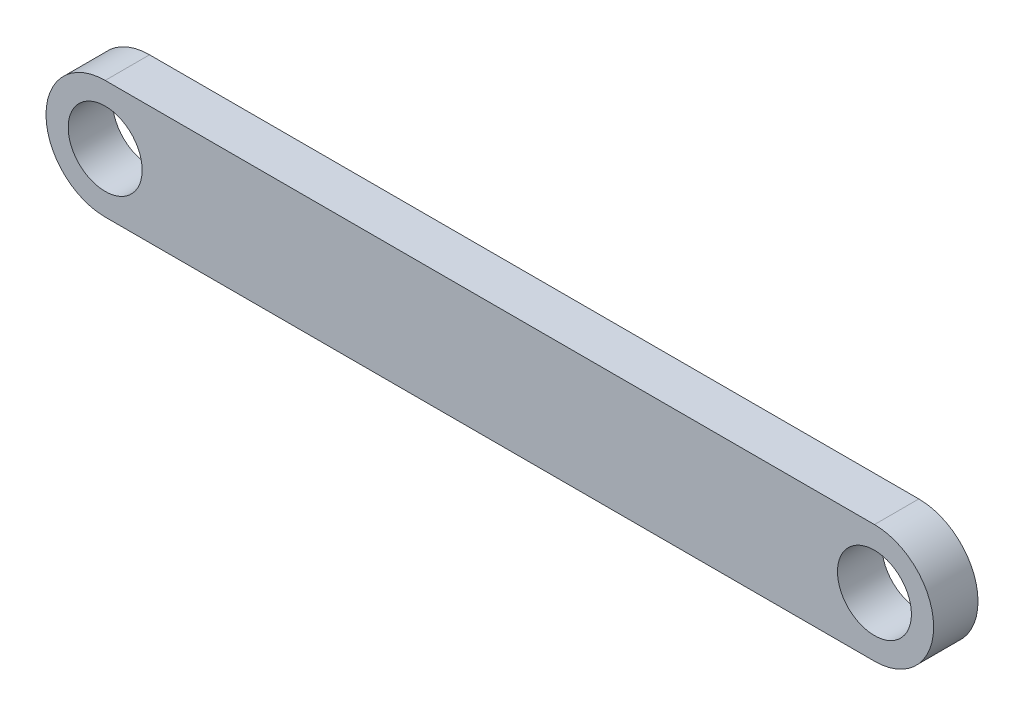
ISO-10303-21;
HEADER;
FILE_DESCRIPTION(('STEP AP214'),'2;1');
FILE_NAME('part.step','',(''),(''),'','','');
FILE_SCHEMA(('AUTOMOTIVE_DESIGN { 1 0 10303 214 1 1 1 1 }'));
ENDSEC;
DATA;
#1=APPLICATION_CONTEXT('core data for automotive mechanical design processes');
#2=APPLICATION_PROTOCOL_DEFINITION('international standard','automotive_design',2000,#1);
#3=PRODUCT_CONTEXT('',#1,'mechanical');
#4=PRODUCT('Part','Part','',(#3));
#5=PRODUCT_RELATED_PRODUCT_CATEGORY('part','',(#4));
#6=PRODUCT_DEFINITION_FORMATION('','',#4);
#7=PRODUCT_DEFINITION_CONTEXT('part definition',#1,'design');
#8=PRODUCT_DEFINITION('design','',#6,#7);
#9=PRODUCT_DEFINITION_SHAPE('','',#8);
#10=(LENGTH_UNIT() NAMED_UNIT(*) SI_UNIT(.MILLI.,.METRE.));
#11=(NAMED_UNIT(*) PLANE_ANGLE_UNIT() SI_UNIT($,.RADIAN.));
#12=(NAMED_UNIT(*) SI_UNIT($,.STERADIAN.) SOLID_ANGLE_UNIT());
#13=UNCERTAINTY_MEASURE_WITH_UNIT(LENGTH_MEASURE(1.E-05),#10,'distance_accuracy_value','');
#14=(GEOMETRIC_REPRESENTATION_CONTEXT(3) GLOBAL_UNCERTAINTY_ASSIGNED_CONTEXT((#13)) GLOBAL_UNIT_ASSIGNED_CONTEXT((#10,
#11,#12)) REPRESENTATION_CONTEXT('',''));
#15=CARTESIAN_POINT('',(0.,0.,0.));
#16=DIRECTION('',(0.,0.,1.));
#17=DIRECTION('',(1.,0.,0.));
#18=AXIS2_PLACEMENT_3D('',#15,#16,#17);
#19=CARTESIAN_POINT('',(0.,0.,3.));
#20=DIRECTION('',(0.,0.,1.));
#21=DIRECTION('',(1.,0.,0.));
#22=AXIS2_PLACEMENT_3D('',#19,#20,#21);
#23=PLANE('',#22);
#24=CARTESIAN_POINT('',(-52.,0.,3.));
#25=DIRECTION('',(0.,0.,1.));
#26=DIRECTION('',(1.,0.,0.));
#27=AXIS2_PLACEMENT_3D('',#24,#25,#26);
#28=CIRCLE('',#27,2.5);
#29=CARTESIAN_POINT('',(-49.5,0.,3.));
#30=VERTEX_POINT('',#29);
#31=EDGE_CURVE('E101',#30,#30,#28,.T.);
#32=ORIENTED_EDGE('',*,*,#31,.F.);
#33=EDGE_LOOP('',(#32));
#34=FACE_BOUND('',#33,.T.);
#35=CARTESIAN_POINT('',(0.,0.,3.));
#36=DIRECTION('',(0.,0.,1.));
#37=DIRECTION('',(1.,0.,0.));
#38=AXIS2_PLACEMENT_3D('',#35,#36,#37);
#39=CIRCLE('',#38,4.);
#40=CARTESIAN_POINT('',(0.,-4.,3.));
#41=VERTEX_POINT('',#40);
#42=CARTESIAN_POINT('',(0.,4.,3.));
#43=VERTEX_POINT('',#42);
#44=EDGE_CURVE('E86',#41,#43,#39,.T.);
#45=ORIENTED_EDGE('',*,*,#44,.T.);
#46=DIRECTION('',(-1.,0.,0.));
#47=VECTOR('',#46,1.);
#48=CARTESIAN_POINT('',(-52.,3.99999999999999,3.));
#49=LINE('',#48,#47);
#50=CARTESIAN_POINT('',(-52.,3.99999999999999,3.));
#51=VERTEX_POINT('',#50);
#52=EDGE_CURVE('E81',#43,#51,#49,.T.);
#53=ORIENTED_EDGE('',*,*,#52,.T.);
#54=CARTESIAN_POINT('',(-52.,0.,3.));
#55=DIRECTION('',(0.,0.,1.));
#56=DIRECTION('',(1.,0.,0.));
#57=AXIS2_PLACEMENT_3D('',#54,#55,#56);
#58=CIRCLE('',#57,4.);
#59=CARTESIAN_POINT('',(-52.,-4.00000000000001,3.));
#60=VERTEX_POINT('',#59);
#61=EDGE_CURVE('E84',#51,#60,#58,.T.);
#62=ORIENTED_EDGE('',*,*,#61,.T.);
#63=DIRECTION('',(1.,0.,0.));
#64=VECTOR('',#63,1.);
#65=CARTESIAN_POINT('',(-52.,-4.00000000000001,3.));
#66=LINE('',#65,#64);
#67=EDGE_CURVE('E51',#60,#41,#66,.T.);
#68=ORIENTED_EDGE('',*,*,#67,.T.);
#69=EDGE_LOOP('',(#45,#53,#62,#68));
#70=FACE_BOUND('',#69,.T.);
#71=CARTESIAN_POINT('',(0.,0.,3.));
#72=DIRECTION('',(0.,0.,1.));
#73=DIRECTION('',(1.,0.,0.));
#74=AXIS2_PLACEMENT_3D('',#71,#72,#73);
#75=CIRCLE('',#74,2.5);
#76=CARTESIAN_POINT('',(2.5,0.,3.));
#77=VERTEX_POINT('',#76);
#78=EDGE_CURVE('E116',#77,#77,#75,.T.);
#79=ORIENTED_EDGE('',*,*,#78,.F.);
#80=EDGE_LOOP('',(#79));
#81=FACE_BOUND('',#80,.T.);
#82=ADVANCED_FACE('F34',(#34,#70,#81),#23,.T.);
#83=CARTESIAN_POINT('',(0.,0.,0.));
#84=DIRECTION('',(0.,0.,1.));
#85=DIRECTION('',(1.,0.,0.));
#86=AXIS2_PLACEMENT_3D('',#83,#84,#85);
#87=PLANE('',#86);
#88=CARTESIAN_POINT('',(0.,0.,0.));
#89=DIRECTION('',(0.,0.,1.));
#90=DIRECTION('',(1.,0.,0.));
#91=AXIS2_PLACEMENT_3D('',#88,#89,#90);
#92=CIRCLE('',#91,4.);
#93=CARTESIAN_POINT('',(0.,-4.,0.));
#94=VERTEX_POINT('',#93);
#95=CARTESIAN_POINT('',(0.,4.,0.));
#96=VERTEX_POINT('',#95);
#97=EDGE_CURVE('E98',#94,#96,#92,.T.);
#98=ORIENTED_EDGE('',*,*,#97,.F.);
#99=DIRECTION('',(1.,0.,0.));
#100=VECTOR('',#99,1.);
#101=CARTESIAN_POINT('',(-52.,-4.00000000000001,0.));
#102=LINE('',#101,#100);
#103=CARTESIAN_POINT('',(-52.,-4.00000000000001,0.));
#104=VERTEX_POINT('',#103);
#105=EDGE_CURVE('E74',#104,#94,#102,.T.);
#106=ORIENTED_EDGE('',*,*,#105,.F.);
#107=CARTESIAN_POINT('',(-52.,0.,0.));
#108=DIRECTION('',(0.,0.,1.));
#109=DIRECTION('',(1.,0.,0.));
#110=AXIS2_PLACEMENT_3D('',#107,#108,#109);
#111=CIRCLE('',#110,4.);
#112=CARTESIAN_POINT('',(-52.,3.99999999999999,0.));
#113=VERTEX_POINT('',#112);
#114=EDGE_CURVE('E68',#113,#104,#111,.T.);
#115=ORIENTED_EDGE('',*,*,#114,.F.);
#116=DIRECTION('',(-1.,0.,0.));
#117=VECTOR('',#116,1.);
#118=CARTESIAN_POINT('',(-52.,3.99999999999999,0.));
#119=LINE('',#118,#117);
#120=EDGE_CURVE('E90',#96,#113,#119,.T.);
#121=ORIENTED_EDGE('',*,*,#120,.F.);
#122=EDGE_LOOP('',(#98,#106,#115,#121));
#123=FACE_BOUND('',#122,.T.);
#124=CARTESIAN_POINT('',(-52.,0.,0.));
#125=DIRECTION('',(0.,0.,1.));
#126=DIRECTION('',(1.,0.,0.));
#127=AXIS2_PLACEMENT_3D('',#124,#125,#126);
#128=CIRCLE('',#127,2.5);
#129=CARTESIAN_POINT('',(-49.5,0.,0.));
#130=VERTEX_POINT('',#129);
#131=EDGE_CURVE('E113',#130,#130,#128,.T.);
#132=ORIENTED_EDGE('',*,*,#131,.T.);
#133=EDGE_LOOP('',(#132));
#134=FACE_BOUND('',#133,.T.);
#135=CARTESIAN_POINT('',(0.,0.,0.));
#136=DIRECTION('',(0.,0.,1.));
#137=DIRECTION('',(1.,0.,0.));
#138=AXIS2_PLACEMENT_3D('',#135,#136,#137);
#139=CIRCLE('',#138,2.5);
#140=CARTESIAN_POINT('',(2.5,0.,0.));
#141=VERTEX_POINT('',#140);
#142=EDGE_CURVE('E119',#141,#141,#139,.T.);
#143=ORIENTED_EDGE('',*,*,#142,.T.);
#144=EDGE_LOOP('',(#143));
#145=FACE_BOUND('',#144,.T.);
#146=ADVANCED_FACE('F109',(#123,#134,#145),#87,.F.);
#147=CARTESIAN_POINT('',(0.,0.,3.));
#148=DIRECTION('',(0.,0.,-1.));
#149=DIRECTION('',(-1.,0.,0.));
#150=AXIS2_PLACEMENT_3D('',#147,#148,#149);
#151=CYLINDRICAL_SURFACE('',#150,4.);
#152=ORIENTED_EDGE('',*,*,#97,.T.);
#153=DIRECTION('',(0.,0.,-1.));
#154=VECTOR('',#153,1.);
#155=CARTESIAN_POINT('',(0.,4.,3.));
#156=LINE('',#155,#154);
#157=EDGE_CURVE('E11',#43,#96,#156,.T.);
#158=ORIENTED_EDGE('',*,*,#157,.F.);
#159=ORIENTED_EDGE('',*,*,#44,.F.);
#160=DIRECTION('',(0.,0.,-1.));
#161=VECTOR('',#160,1.);
#162=CARTESIAN_POINT('',(0.,-4.,3.));
#163=LINE('',#162,#161);
#164=EDGE_CURVE('E94',#41,#94,#163,.T.);
#165=ORIENTED_EDGE('',*,*,#164,.T.);
#166=EDGE_LOOP('',(#152,#158,#159,#165));
#167=FACE_BOUND('',#166,.T.);
#168=ADVANCED_FACE('F36',(#167),#151,.T.);
#169=CARTESIAN_POINT('',(-52.,3.99999999999999,3.));
#170=DIRECTION('',(0.,-1.,0.));
#171=DIRECTION('',(1.,0.,0.));
#172=AXIS2_PLACEMENT_3D('',#169,#170,#171);
#173=PLANE('',#172);
#174=ORIENTED_EDGE('',*,*,#120,.T.);
#175=DIRECTION('',(0.,0.,-1.));
#176=VECTOR('',#175,1.);
#177=CARTESIAN_POINT('',(-52.,3.99999999999999,3.));
#178=LINE('',#177,#176);
#179=EDGE_CURVE('E43',#51,#113,#178,.T.);
#180=ORIENTED_EDGE('',*,*,#179,.F.);
#181=ORIENTED_EDGE('',*,*,#52,.F.);
#182=ORIENTED_EDGE('',*,*,#157,.T.);
#183=EDGE_LOOP('',(#174,#180,#181,#182));
#184=FACE_BOUND('',#183,.T.);
#185=ADVANCED_FACE('F89',(#184),#173,.F.);
#186=CARTESIAN_POINT('',(-52.,0.,3.));
#187=DIRECTION('',(0.,0.,-1.));
#188=DIRECTION('',(-1.,0.,0.));
#189=AXIS2_PLACEMENT_3D('',#186,#187,#188);
#190=CYLINDRICAL_SURFACE('',#189,4.);
#191=ORIENTED_EDGE('',*,*,#114,.T.);
#192=DIRECTION('',(0.,0.,-1.));
#193=VECTOR('',#192,1.);
#194=CARTESIAN_POINT('',(-52.,-4.00000000000001,3.));
#195=LINE('',#194,#193);
#196=EDGE_CURVE('E91',#60,#104,#195,.T.);
#197=ORIENTED_EDGE('',*,*,#196,.F.);
#198=ORIENTED_EDGE('',*,*,#61,.F.);
#199=ORIENTED_EDGE('',*,*,#179,.T.);
#200=EDGE_LOOP('',(#191,#197,#198,#199));
#201=FACE_BOUND('',#200,.T.);
#202=ADVANCED_FACE('F92',(#201),#190,.T.);
#203=CARTESIAN_POINT('',(-52.,-4.00000000000001,3.));
#204=DIRECTION('',(0.,1.,0.));
#205=DIRECTION('',(-1.,0.,0.));
#206=AXIS2_PLACEMENT_3D('',#203,#204,#205);
#207=PLANE('',#206);
#208=ORIENTED_EDGE('',*,*,#105,.T.);
#209=ORIENTED_EDGE('',*,*,#164,.F.);
#210=ORIENTED_EDGE('',*,*,#67,.F.);
#211=ORIENTED_EDGE('',*,*,#196,.T.);
#212=EDGE_LOOP('',(#208,#209,#210,#211));
#213=FACE_BOUND('',#212,.T.);
#214=ADVANCED_FACE('F106',(#213),#207,.F.);
#215=CARTESIAN_POINT('',(-52.,0.,3.));
#216=DIRECTION('',(0.,0.,-1.));
#217=DIRECTION('',(-1.,0.,0.));
#218=AXIS2_PLACEMENT_3D('',#215,#216,#217);
#219=CYLINDRICAL_SURFACE('',#218,2.5);
#220=ORIENTED_EDGE('',*,*,#31,.T.);
#221=EDGE_LOOP('',(#220));
#222=FACE_BOUND('',#221,.T.);
#223=ORIENTED_EDGE('',*,*,#131,.F.);
#224=EDGE_LOOP('',(#223));
#225=FACE_BOUND('',#224,.T.);
#226=ADVANCED_FACE('F136',(#222,#225),#219,.F.);
#227=CARTESIAN_POINT('',(0.,0.,3.));
#228=DIRECTION('',(0.,0.,-1.));
#229=DIRECTION('',(-1.,0.,0.));
#230=AXIS2_PLACEMENT_3D('',#227,#228,#229);
#231=CYLINDRICAL_SURFACE('',#230,2.5);
#232=ORIENTED_EDGE('',*,*,#78,.T.);
#233=EDGE_LOOP('',(#232));
#234=FACE_BOUND('',#233,.T.);
#235=ORIENTED_EDGE('',*,*,#142,.F.);
#236=EDGE_LOOP('',(#235));
#237=FACE_BOUND('',#236,.T.);
#238=ADVANCED_FACE('F125',(#234,#237),#231,.F.);
#239=CLOSED_SHELL('',(#82,#146,#168,#185,#202,#214,#226,#238));
#240=MANIFOLD_SOLID_BREP('B2',#239);
#241=ADVANCED_BREP_SHAPE_REPRESENTATION('',(#18,#240),#14);
#242=SHAPE_DEFINITION_REPRESENTATION(#9,#241);
ENDSEC;
END-ISO-10303-21;
